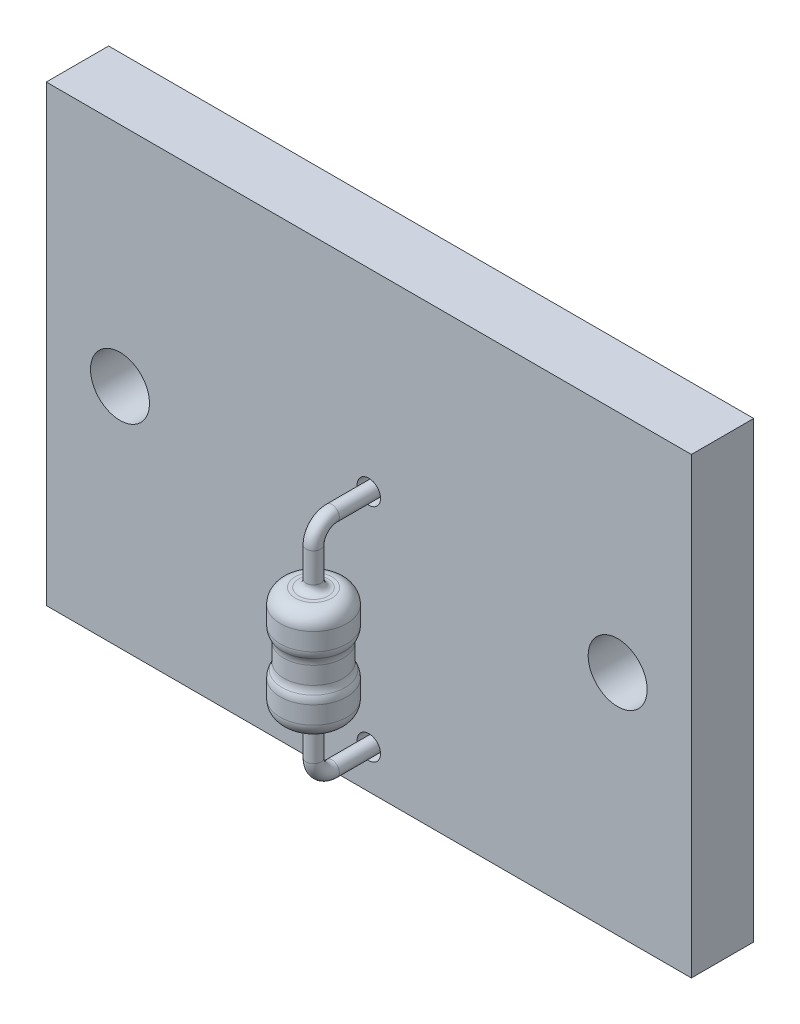
ISO-10303-21;
HEADER;
FILE_DESCRIPTION(('STEP AP214'),'2;1');
FILE_NAME('part.step','',(''),(''),'','','');
FILE_SCHEMA(('AUTOMOTIVE_DESIGN { 1 0 10303 214 1 1 1 1 }'));
ENDSEC;
DATA;
#1=APPLICATION_CONTEXT('core data for automotive mechanical design processes');
#2=APPLICATION_PROTOCOL_DEFINITION('international standard','automotive_design',2000,#1);
#3=PRODUCT_CONTEXT('',#1,'mechanical');
#4=PRODUCT('Part','Part','',(#3));
#5=PRODUCT_RELATED_PRODUCT_CATEGORY('part','',(#4));
#6=PRODUCT_DEFINITION_FORMATION('','',#4);
#7=PRODUCT_DEFINITION_CONTEXT('part definition',#1,'design');
#8=PRODUCT_DEFINITION('design','',#6,#7);
#9=PRODUCT_DEFINITION_SHAPE('','',#8);
#10=(LENGTH_UNIT() NAMED_UNIT(*) SI_UNIT(.MILLI.,.METRE.));
#11=(NAMED_UNIT(*) PLANE_ANGLE_UNIT() SI_UNIT($,.RADIAN.));
#12=(NAMED_UNIT(*) SI_UNIT($,.STERADIAN.) SOLID_ANGLE_UNIT());
#13=UNCERTAINTY_MEASURE_WITH_UNIT(LENGTH_MEASURE(1.E-05),#10,'distance_accuracy_value','');
#14=(GEOMETRIC_REPRESENTATION_CONTEXT(3) GLOBAL_UNCERTAINTY_ASSIGNED_CONTEXT((#13)) GLOBAL_UNIT_ASSIGNED_CONTEXT((#10,
#11,#12)) REPRESENTATION_CONTEXT('',''));
#15=CARTESIAN_POINT('',(0.,0.,0.));
#16=DIRECTION('',(0.,0.,1.));
#17=DIRECTION('',(1.,0.,0.));
#18=AXIS2_PLACEMENT_3D('',#15,#16,#17);
#19=CARTESIAN_POINT('',(38.7500230193259,116.750030386428,-1.50000041126607));
#20=DIRECTION('',(0.,-4.37139536292866E-08,-0.999999999999999));
#21=DIRECTION('',(8.74279066920296E-08,-0.999999999999995,4.37139536292867E-08));
#22=AXIS2_PLACEMENT_3D('',#19,#20,#21);
#23=PLANE('',#22);
#24=CARTESIAN_POINT('',(38.7500230193259,116.750030386428,-1.50000041126607));
#25=DIRECTION('',(0.,-4.37139534327458E-08,-0.999999999999999));
#26=DIRECTION('',(8.74279066920296E-08,-0.999999999999995,4.3713953432746E-08));
#27=AXIS2_PLACEMENT_3D('',#24,#25,#26);
#28=CIRCLE('',#27,0.2);
#29=CARTESIAN_POINT('',(38.7500230368114,116.550030386428,-1.50000040252328));
#30=VERTEX_POINT('',#29);
#31=EDGE_CURVE('P0_E63',#30,#30,#28,.F.);
#32=ORIENTED_EDGE('',*,*,#31,.F.);
#33=EDGE_LOOP('',(#32));
#34=FACE_BOUND('',#33,.T.);
#35=ADVANCED_FACE('P0_F16',(#34),#23,.T.);
#36=CARTESIAN_POINT('',(38.7500230193259,116.750030495713,0.99999958873393));
#37=DIRECTION('',(0.,-4.37139534327458E-08,-0.999999999999999));
#38=DIRECTION('',(8.74279066920296E-08,-0.999999999999995,4.3713953432746E-08));
#39=AXIS2_PLACEMENT_3D('',#36,#37,#38);
#40=CYLINDRICAL_SURFACE('',#39,0.2);
#41=ORIENTED_EDGE('',*,*,#31,.T.);
#42=EDGE_LOOP('',(#41));
#43=FACE_BOUND('',#42,.T.);
#44=CARTESIAN_POINT('',(38.7500230193259,116.750030495713,0.999999588733931));
#45=DIRECTION('',(0.,-4.37139534684743E-08,-0.999999999999999));
#46=DIRECTION('',(8.74279066920296E-08,-0.999999999999995,4.37139534684745E-08));
#47=AXIS2_PLACEMENT_3D('',#44,#45,#46);
#48=CIRCLE('',#47,0.2);
#49=CARTESIAN_POINT('',(38.7500230368114,116.550030495713,0.999999597476721));
#50=VERTEX_POINT('',#49);
#51=EDGE_CURVE('P0_E264',#50,#50,#48,.F.);
#52=ORIENTED_EDGE('',*,*,#51,.F.);
#53=EDGE_LOOP('',(#52));
#54=FACE_BOUND('',#53,.T.);
#55=ADVANCED_FACE('P0_F208',(#43,#54),#40,.T.);
#56=CARTESIAN_POINT('',(38.7500229756119,117.250030495713,0.999999566876954));
#57=DIRECTION('',(0.999999999999996,8.74279066920297E-08,0.));
#58=DIRECTION('',(-8.74279066920296E-08,0.999999999999995,-4.3713953463975E-08));
#59=AXIS2_PLACEMENT_3D('',#56,#57,#58);
#60=TOROIDAL_SURFACE('',#59,0.500000000000003,0.2);
#61=CARTESIAN_POINT('',(38.7500229756119,117.25003051757,1.49999956687695));
#62=DIRECTION('',(-8.74279066920296E-08,0.999999999999995,-4.37139533460098E-08));
#63=DIRECTION('',(-0.999999999999996,-8.74279066920297E-08,0.));
#64=AXIS2_PLACEMENT_3D('',#61,#62,#63);
#65=CIRCLE('',#64,0.2);
#66=CARTESIAN_POINT('',(38.5500229756119,117.250030500084,1.49999956687695));
#67=VERTEX_POINT('',#66);
#68=EDGE_CURVE('P0_E202',#67,#67,#65,.T.);
#69=ORIENTED_EDGE('',*,*,#68,.F.);
#70=EDGE_LOOP('',(#69));
#71=FACE_BOUND('',#70,.T.);
#72=ORIENTED_EDGE('',*,*,#51,.T.);
#73=EDGE_LOOP('',(#72));
#74=FACE_BOUND('',#73,.T.);
#75=ADVANCED_FACE('P0_F206',(#71,#74),#60,.T.);
#76=CARTESIAN_POINT('',(38.7500229756119,117.25003051757,1.49999956687695));
#77=DIRECTION('',(-8.74279066920296E-08,0.999999999999995,-4.37139533460098E-08));
#78=DIRECTION('',(-0.999999999999996,-8.74279066920297E-08,0.));
#79=AXIS2_PLACEMENT_3D('',#76,#77,#78);
#80=CYLINDRICAL_SURFACE('',#79,0.2);
#81=CARTESIAN_POINT('',(38.7500229056696,118.05003051757,1.49999953190579));
#82=DIRECTION('',(-8.74279066920296E-08,0.999999999999995,-4.37139533460098E-08));
#83=DIRECTION('',(-0.999999999999996,-8.74279066920297E-08,0.));
#84=AXIS2_PLACEMENT_3D('',#81,#82,#83);
#85=CIRCLE('',#84,0.2);
#86=CARTESIAN_POINT('',(38.5500229056696,118.050030500084,1.49999953190579));
#87=VERTEX_POINT('',#86);
#88=EDGE_CURVE('P0_E199',#87,#87,#85,.F.);
#89=ORIENTED_EDGE('',*,*,#88,.T.);
#90=EDGE_LOOP('',(#89));
#91=FACE_BOUND('',#90,.T.);
#92=ORIENTED_EDGE('',*,*,#68,.T.);
#93=EDGE_LOOP('',(#92));
#94=FACE_BOUND('',#93,.T.);
#95=ADVANCED_FACE('P0_F181',(#91,#94),#80,.T.);
#96=CARTESIAN_POINT('',(38.7500229056696,118.05003051757,1.49999953190579));
#97=DIRECTION('',(-8.74279066920296E-08,0.999999999999995,-4.37139533460098E-08));
#98=DIRECTION('',(-0.999999999999996,-8.74279066920297E-08,0.));
#99=AXIS2_PLACEMENT_3D('',#96,#97,#98);
#100=TOROIDAL_SURFACE('',#99,0.399999999999999,0.2);
#101=CARTESIAN_POINT('',(38.750022888184,118.25003051757,1.499999523163));
#102=DIRECTION('',(8.74279066920296E-08,-0.999999999999995,4.37139533460098E-08));
#103=DIRECTION('',(0.999999999999996,8.74279121321211E-08,0.));
#104=AXIS2_PLACEMENT_3D('',#101,#102,#103);
#105=CIRCLE('',#104,0.399999999999999);
#106=CARTESIAN_POINT('',(39.150022888184,118.250030552541,1.499999523163));
#107=VERTEX_POINT('',#106);
#108=CARTESIAN_POINT('',(38.350022888184,118.250030482599,1.499999523163));
#109=VERTEX_POINT('',#108);
#110=EDGE_CURVE('P0_E187',#107,#109,#105,.T.);
#111=ORIENTED_EDGE('',*,*,#110,.T.);
#112=CARTESIAN_POINT('',(38.750022888184,118.25003051757,1.499999523163));
#113=DIRECTION('',(8.74279066920296E-08,-0.999999999999995,4.37139533460098E-08));
#114=DIRECTION('',(-0.999999999999996,-8.74279121321211E-08,0.));
#115=AXIS2_PLACEMENT_3D('',#112,#113,#114);
#116=CIRCLE('',#115,0.399999999999999);
#117=EDGE_CURVE('P0_E168',#109,#107,#116,.T.);
#118=ORIENTED_EDGE('',*,*,#117,.T.);
#119=EDGE_LOOP('',(#111,#118));
#120=FACE_BOUND('',#119,.T.);
#121=ORIENTED_EDGE('',*,*,#88,.F.);
#122=EDGE_LOOP('',(#121));
#123=FACE_BOUND('',#122,.T.);
#124=ADVANCED_FACE('P0_F172',(#120,#123),#100,.F.);
#125=CARTESIAN_POINT('',(38.750022888184,118.25003051757,1.499999523163));
#126=DIRECTION('',(-8.74279066920296E-08,0.999999999999995,-4.37139533460098E-08));
#127=DIRECTION('',(-0.999999999999996,-8.74279066920297E-08,0.));
#128=AXIS2_PLACEMENT_3D('',#125,#126,#127);
#129=PLANE('',#128);
#130=CARTESIAN_POINT('',(38.750022888184,118.25003051757,1.499999523163));
#131=DIRECTION('',(-8.74279066920296E-08,0.999999999999995,-4.37139533460098E-08));
#132=DIRECTION('',(-0.999999999999996,-8.74278982543339E-08,0.));
#133=AXIS2_PLACEMENT_3D('',#130,#131,#132);
#134=CIRCLE('',#133,0.499999999999995);
#135=CARTESIAN_POINT('',(38.250022888184,118.250030473856,1.499999523163));
#136=VERTEX_POINT('',#135);
#137=CARTESIAN_POINT('',(39.250022888184,118.250030561284,1.499999523163));
#138=VERTEX_POINT('',#137);
#139=EDGE_CURVE('P0_E516',#136,#138,#134,.T.);
#140=ORIENTED_EDGE('',*,*,#139,.F.);
#141=CARTESIAN_POINT('',(38.750022888184,118.25003051757,1.499999523163));
#142=DIRECTION('',(-8.74279066920296E-08,0.999999999999995,-4.37139533460098E-08));
#143=DIRECTION('',(0.999999999999996,8.74278982543339E-08,0.));
#144=AXIS2_PLACEMENT_3D('',#141,#142,#143);
#145=CIRCLE('',#144,0.499999999999995);
#146=EDGE_CURVE('P0_E198',#138,#136,#145,.T.);
#147=ORIENTED_EDGE('',*,*,#146,.F.);
#148=EDGE_LOOP('',(#140,#147));
#149=FACE_BOUND('',#148,.T.);
#150=ORIENTED_EDGE('',*,*,#117,.F.);
#151=ORIENTED_EDGE('',*,*,#110,.F.);
#152=EDGE_LOOP('',(#150,#151));
#153=FACE_BOUND('',#152,.T.);
#154=ADVANCED_FACE('P0_F145',(#149,#153),#129,.F.);
#155=CARTESIAN_POINT('',(38.7500228532128,118.65003051757,1.49999950567742));
#156=DIRECTION('',(-8.74279066920296E-08,0.999999999999995,-4.37139533460098E-08));
#157=DIRECTION('',(-0.999999999999996,-8.74279066920297E-08,0.));
#158=AXIS2_PLACEMENT_3D('',#155,#156,#157);
#159=TOROIDAL_SURFACE('',#158,0.499999999999995,0.4);
#160=CARTESIAN_POINT('',(38.7500228532128,118.65003051757,1.49999950567742));
#161=DIRECTION('',(8.74279066920296E-08,-0.999999999999995,4.37139533460098E-08));
#162=DIRECTION('',(0.999999999999996,8.74279066920297E-08,0.));
#163=AXIS2_PLACEMENT_3D('',#160,#161,#162);
#164=CIRCLE('',#163,0.9);
#165=CARTESIAN_POINT('',(39.6500228532128,118.650030596255,1.49999950567742));
#166=VERTEX_POINT('',#165);
#167=EDGE_CURVE('P0_E136',#166,#166,#164,.F.);
#168=ORIENTED_EDGE('',*,*,#167,.F.);
#169=EDGE_LOOP('',(#168));
#170=FACE_BOUND('',#169,.T.);
#171=ORIENTED_EDGE('',*,*,#146,.T.);
#172=ORIENTED_EDGE('',*,*,#139,.T.);
#173=EDGE_LOOP('',(#171,#172));
#174=FACE_BOUND('',#173,.T.);
#175=ADVANCED_FACE('P0_F141',(#170,#174),#159,.T.);
#176=CARTESIAN_POINT('',(38.7500228007561,119.25003051757,1.49999947944905));
#177=DIRECTION('',(8.74279066920296E-08,-0.999999999999995,4.37139533460098E-08));
#178=DIRECTION('',(0.999999999999996,8.74279066920297E-08,0.));
#179=AXIS2_PLACEMENT_3D('',#176,#177,#178);
#180=CYLINDRICAL_SURFACE('',#179,0.9);
#181=CARTESIAN_POINT('',(38.7500228114855,119.127307314056,1.49999948481376));
#182=DIRECTION('',(8.74279066920296E-08,-0.999999999999995,4.37139533460098E-08));
#183=DIRECTION('',(0.999999999999996,8.74279066920297E-08,0.));
#184=AXIS2_PLACEMENT_3D('',#181,#182,#183);
#185=CIRCLE('',#184,0.9);
#186=CARTESIAN_POINT('',(39.6500228114855,119.127307392741,1.49999948481376));
#187=VERTEX_POINT('',#186);
#188=EDGE_CURVE('P0_E133',#187,#187,#185,.F.);
#189=ORIENTED_EDGE('',*,*,#188,.F.);
#190=EDGE_LOOP('',(#189));
#191=FACE_BOUND('',#190,.T.);
#192=ORIENTED_EDGE('',*,*,#167,.T.);
#193=EDGE_LOOP('',(#192));
#194=FACE_BOUND('',#193,.T.);
#195=ADVANCED_FACE('P0_F128',(#191,#194),#180,.T.);
#196=CARTESIAN_POINT('',(38.7500228114855,119.127307314056,1.49999948481376));
#197=DIRECTION('',(8.74279066920296E-08,-0.999999999999995,4.37139533460098E-08));
#198=DIRECTION('',(0.999999999999996,8.74279066920297E-08,0.));
#199=AXIS2_PLACEMENT_3D('',#196,#197,#198);
#200=TOROIDAL_SURFACE('',#199,0.500000000000002,0.4);
#201=ORIENTED_EDGE('',*,*,#188,.T.);
#202=EDGE_LOOP('',(#201));
#203=FACE_BOUND('',#202,.T.);
#204=CARTESIAN_POINT('',(38.7500227945552,119.320956481366,1.49999947634859));
#205=DIRECTION('',(8.74279066920296E-08,-0.999999999999995,4.37139533460098E-08));
#206=DIRECTION('',(0.999999999999996,8.74279066920297E-08,0.));
#207=AXIS2_PLACEMENT_3D('',#204,#205,#206);
#208=CIRCLE('',#207,0.849999999999843);
#209=CARTESIAN_POINT('',(39.600022794555,119.32095655568,1.49999947634859));
#210=VERTEX_POINT('',#209);
#211=EDGE_CURVE('P0_E115',#210,#210,#208,.T.);
#212=ORIENTED_EDGE('',*,*,#211,.T.);
#213=EDGE_LOOP('',(#212));
#214=FACE_BOUND('',#213,.T.);
#215=ADVANCED_FACE('P0_F124',(#203,#214),#200,.T.);
#216=CARTESIAN_POINT('',(38.7500227776248,119.514605648676,1.49999946788342));
#217=DIRECTION('',(8.74279066920296E-08,-0.999999999999995,4.37139533460098E-08));
#218=DIRECTION('',(0.999999999999996,8.74279066920297E-08,0.));
#219=AXIS2_PLACEMENT_3D('',#216,#217,#218);
#220=TOROIDAL_SURFACE('',#219,1.2,0.4);
#221=ORIENTED_EDGE('',*,*,#211,.F.);
#222=EDGE_LOOP('',(#221));
#223=FACE_BOUND('',#222,.T.);
#224=CARTESIAN_POINT('',(38.7500227776248,119.514605648676,1.49999946788342));
#225=DIRECTION('',(8.74279066920296E-08,-0.999999999999995,4.37139533460098E-08));
#226=DIRECTION('',(0.999999999999996,8.74279066920297E-08,0.));
#227=AXIS2_PLACEMENT_3D('',#224,#225,#226);
#228=CIRCLE('',#227,0.8);
#229=CARTESIAN_POINT('',(39.5500227776248,119.514605718618,1.49999946788342));
#230=VERTEX_POINT('',#229);
#231=EDGE_CURVE('P0_E112',#230,#230,#228,.F.);
#232=ORIENTED_EDGE('',*,*,#231,.F.);
#233=EDGE_LOOP('',(#232));
#234=FACE_BOUND('',#233,.T.);
#235=ADVANCED_FACE('P0_F120',(#223,#234),#220,.F.);
#236=CARTESIAN_POINT('',(38.7500227133282,120.25003051757,1.49999943573509));
#237=DIRECTION('',(8.74279066920296E-08,-0.999999999999995,4.37139533460098E-08));
#238=DIRECTION('',(0.999999999999996,8.74279066920297E-08,0.));
#239=AXIS2_PLACEMENT_3D('',#236,#237,#238);
#240=CYLINDRICAL_SURFACE('',#239,0.8);
#241=ORIENTED_EDGE('',*,*,#231,.T.);
#242=EDGE_LOOP('',(#241));
#243=FACE_BOUND('',#242,.T.);
#244=CARTESIAN_POINT('',(38.7500227364594,119.985455386464,1.49999944730072));
#245=DIRECTION('',(-8.74279066920296E-08,0.999999999999995,-4.37139533460098E-08));
#246=DIRECTION('',(-0.999999999999996,-8.74279066920297E-08,0.));
#247=AXIS2_PLACEMENT_3D('',#244,#245,#246);
#248=CIRCLE('',#247,0.8);
#249=CARTESIAN_POINT('',(37.9500227364594,119.985455316522,1.49999944730072));
#250=VERTEX_POINT('',#249);
#251=EDGE_CURVE('P0_E107',#250,#250,#248,.F.);
#252=ORIENTED_EDGE('',*,*,#251,.T.);
#253=EDGE_LOOP('',(#252));
#254=FACE_BOUND('',#253,.T.);
#255=ADVANCED_FACE('P0_F123',(#243,#254),#240,.T.);
#256=CARTESIAN_POINT('',(38.7500227364594,119.985455386464,1.49999944730072));
#257=DIRECTION('',(-8.74279066920296E-08,0.999999999999995,-4.37139533460098E-08));
#258=DIRECTION('',(-0.999999999999996,-8.74279066920297E-08,0.));
#259=AXIS2_PLACEMENT_3D('',#256,#257,#258);
#260=TOROIDAL_SURFACE('',#259,1.2,0.4);
#261=CARTESIAN_POINT('',(38.7500227195291,120.179104553774,1.49999943883555));
#262=DIRECTION('',(8.74279066920296E-08,-0.999999999999995,4.37139533460098E-08));
#263=DIRECTION('',(0.999999999999996,8.74279066920297E-08,0.));
#264=AXIS2_PLACEMENT_3D('',#261,#262,#263);
#265=CIRCLE('',#264,0.850000000000157);
#266=CARTESIAN_POINT('',(39.6000227195293,120.179104628088,1.49999943883555));
#267=VERTEX_POINT('',#266);
#268=EDGE_CURVE('P0_E105',#267,#267,#265,.F.);
#269=ORIENTED_EDGE('',*,*,#268,.F.);
#270=EDGE_LOOP('',(#269));
#271=FACE_BOUND('',#270,.T.);
#272=ORIENTED_EDGE('',*,*,#251,.F.);
#273=EDGE_LOOP('',(#272));
#274=FACE_BOUND('',#273,.T.);
#275=ADVANCED_FACE('P0_F99',(#271,#274),#260,.F.);
#276=CARTESIAN_POINT('',(38.7500227025988,120.372753721084,1.49999943037038));
#277=DIRECTION('',(8.74279066920296E-08,-0.999999999999995,4.37139533460098E-08));
#278=DIRECTION('',(0.999999999999996,8.74279066920297E-08,0.));
#279=AXIS2_PLACEMENT_3D('',#276,#277,#278);
#280=TOROIDAL_SURFACE('',#279,0.500000000000002,0.4);
#281=ORIENTED_EDGE('',*,*,#268,.T.);
#282=EDGE_LOOP('',(#281));
#283=FACE_BOUND('',#282,.T.);
#284=CARTESIAN_POINT('',(38.7500227025988,120.372753721084,1.49999943037038));
#285=DIRECTION('',(8.74279066920296E-08,-0.999999999999995,4.37139533460098E-08));
#286=DIRECTION('',(0.999999999999996,8.74279066920297E-08,0.));
#287=AXIS2_PLACEMENT_3D('',#284,#285,#286);
#288=CIRCLE('',#287,0.9);
#289=CARTESIAN_POINT('',(39.6500227025987,120.372753799769,1.49999943037038));
#290=VERTEX_POINT('',#289);
#291=EDGE_CURVE('P0_E78',#290,#290,#288,.F.);
#292=ORIENTED_EDGE('',*,*,#291,.F.);
#293=EDGE_LOOP('',(#292));
#294=FACE_BOUND('',#293,.T.);
#295=ADVANCED_FACE('P0_F95',(#283,#294),#280,.T.);
#296=CARTESIAN_POINT('',(38.7500226259003,121.25003051757,1.49999939202114));
#297=DIRECTION('',(8.74279066920296E-08,-0.999999999999995,4.37139533460098E-08));
#298=DIRECTION('',(0.999999999999996,8.74279066920297E-08,0.));
#299=AXIS2_PLACEMENT_3D('',#296,#297,#298);
#300=CYLINDRICAL_SURFACE('',#299,0.9);
#301=ORIENTED_EDGE('',*,*,#291,.T.);
#302=EDGE_LOOP('',(#301));
#303=FACE_BOUND('',#302,.T.);
#304=CARTESIAN_POINT('',(38.7500226608714,120.85003051757,1.49999940950672));
#305=DIRECTION('',(-8.74279066920296E-08,0.999999999999995,-4.37139533460098E-08));
#306=DIRECTION('',(-0.999999999999996,-8.74279066920297E-08,0.));
#307=AXIS2_PLACEMENT_3D('',#304,#305,#306);
#308=CIRCLE('',#307,0.9);
#309=CARTESIAN_POINT('',(37.8500226608714,120.850030438885,1.49999940950672));
#310=VERTEX_POINT('',#309);
#311=EDGE_CURVE('P0_E70',#310,#310,#308,.T.);
#312=ORIENTED_EDGE('',*,*,#311,.F.);
#313=EDGE_LOOP('',(#312));
#314=FACE_BOUND('',#313,.T.);
#315=ADVANCED_FACE('P0_F89',(#303,#314),#300,.T.);
#316=CARTESIAN_POINT('',(38.7500226608714,120.85003051757,1.49999940950672));
#317=DIRECTION('',(-8.74279066920296E-08,0.999999999999995,-4.37139533460098E-08));
#318=DIRECTION('',(-0.999999999999996,-8.74279066920297E-08,0.));
#319=AXIS2_PLACEMENT_3D('',#316,#317,#318);
#320=TOROIDAL_SURFACE('',#319,0.500000000000002,0.4);
#321=CARTESIAN_POINT('',(38.7500226259003,121.25003051757,1.49999939202114));
#322=DIRECTION('',(8.74279066920296E-08,-0.999999999999995,4.37139533460098E-08));
#323=DIRECTION('',(-0.999999999999996,-8.74278982543326E-08,0.));
#324=AXIS2_PLACEMENT_3D('',#321,#322,#323);
#325=CIRCLE('',#324,0.500000000000002);
#326=CARTESIAN_POINT('',(39.2500226259003,121.250030561284,1.49999939202114));
#327=VERTEX_POINT('',#326);
#328=CARTESIAN_POINT('',(38.2500226259003,121.250030473856,1.49999939202114));
#329=VERTEX_POINT('',#328);
#330=EDGE_CURVE('P0_E56',#327,#329,#325,.F.);
#331=ORIENTED_EDGE('',*,*,#330,.F.);
#332=CARTESIAN_POINT('',(38.7500226259003,121.25003051757,1.49999939202114));
#333=DIRECTION('',(8.74279066920296E-08,-0.999999999999995,4.37139533460098E-08));
#334=DIRECTION('',(0.999999999999996,8.74278982543326E-08,0.));
#335=AXIS2_PLACEMENT_3D('',#332,#333,#334);
#336=CIRCLE('',#335,0.500000000000002);
#337=EDGE_CURVE('P0_E59',#327,#329,#336,.T.);
#338=ORIENTED_EDGE('',*,*,#337,.T.);
#339=EDGE_LOOP('',(#331,#338));
#340=FACE_BOUND('',#339,.T.);
#341=ORIENTED_EDGE('',*,*,#311,.T.);
#342=EDGE_LOOP('',(#341));
#343=FACE_BOUND('',#342,.T.);
#344=ADVANCED_FACE('P0_F67',(#340,#343),#320,.T.);
#345=CARTESIAN_POINT('',(38.7500226259003,121.25003051757,1.49999939202114));
#346=DIRECTION('',(-8.74279066920296E-08,0.999999999999995,-4.37139533460098E-08));
#347=DIRECTION('',(-0.999999999999996,-8.74279066920297E-08,0.));
#348=AXIS2_PLACEMENT_3D('',#345,#346,#347);
#349=PLANE('',#348);
#350=ORIENTED_EDGE('',*,*,#337,.F.);
#351=ORIENTED_EDGE('',*,*,#330,.T.);
#352=EDGE_LOOP('',(#350,#351));
#353=FACE_BOUND('',#352,.T.);
#354=CARTESIAN_POINT('',(38.7500226259003,121.25003051757,1.49999939202114));
#355=DIRECTION('',(-8.74279066920296E-08,0.999999999999995,-4.37139533460098E-08));
#356=DIRECTION('',(0.999999999999996,8.74279121321195E-08,0.));
#357=AXIS2_PLACEMENT_3D('',#354,#355,#356);
#358=CIRCLE('',#357,0.400000000000006);
#359=CARTESIAN_POINT('',(38.3500226259003,121.250030482599,1.49999939202114));
#360=VERTEX_POINT('',#359);
#361=CARTESIAN_POINT('',(39.1500226259003,121.250030552541,1.49999939202114));
#362=VERTEX_POINT('',#361);
#363=EDGE_CURVE('P0_E35',#360,#362,#358,.F.);
#364=ORIENTED_EDGE('',*,*,#363,.T.);
#365=CARTESIAN_POINT('',(38.7500226259003,121.25003051757,1.49999939202114));
#366=DIRECTION('',(-8.74279066920296E-08,0.999999999999995,-4.37139533460098E-08));
#367=DIRECTION('',(-0.999999999999996,-8.74279121321195E-08,0.));
#368=AXIS2_PLACEMENT_3D('',#365,#366,#367);
#369=CIRCLE('',#368,0.400000000000006);
#370=EDGE_CURVE('P0_E69',#362,#360,#369,.F.);
#371=ORIENTED_EDGE('',*,*,#370,.T.);
#372=EDGE_LOOP('',(#364,#371));
#373=FACE_BOUND('',#372,.T.);
#374=ADVANCED_FACE('P0_F61',(#353,#373),#349,.T.);
#375=CARTESIAN_POINT('',(38.7500226084147,121.45003051757,1.49999938327835));
#376=DIRECTION('',(-8.74279066920296E-08,0.999999999999995,-4.37139533460098E-08));
#377=DIRECTION('',(-0.999999999999996,-8.74279066920297E-08,0.));
#378=AXIS2_PLACEMENT_3D('',#375,#376,#377);
#379=TOROIDAL_SURFACE('',#378,0.400000000000006,0.2);
#380=ORIENTED_EDGE('',*,*,#363,.F.);
#381=ORIENTED_EDGE('',*,*,#370,.F.);
#382=EDGE_LOOP('',(#380,#381));
#383=FACE_BOUND('',#382,.T.);
#384=CARTESIAN_POINT('',(38.7500226084147,121.45003051757,1.49999938327835));
#385=DIRECTION('',(8.74279066920296E-08,-0.999999999999995,4.37139534375294E-08));
#386=DIRECTION('',(0.,4.37139534375292E-08,0.999999999999999));
#387=AXIS2_PLACEMENT_3D('',#384,#385,#386);
#388=CIRCLE('',#387,0.2);
#389=CARTESIAN_POINT('',(38.7500226084147,121.450030526313,1.69999938327835));
#390=VERTEX_POINT('',#389);
#391=EDGE_CURVE('P0_E244',#390,#390,#388,.F.);
#392=ORIENTED_EDGE('',*,*,#391,.F.);
#393=EDGE_LOOP('',(#392));
#394=FACE_BOUND('',#393,.T.);
#395=ADVANCED_FACE('P0_F247',(#383,#394),#379,.F.);
#396=CARTESIAN_POINT('',(38.7500225384724,122.25003051757,1.49999934830719));
#397=DIRECTION('',(8.74279066920296E-08,-0.999999999999995,4.37139534375294E-08));
#398=DIRECTION('',(0.,4.37139534375292E-08,0.999999999999999));
#399=AXIS2_PLACEMENT_3D('',#396,#397,#398);
#400=CYLINDRICAL_SURFACE('',#399,0.2);
#401=CARTESIAN_POINT('',(38.7500225384724,122.25003051757,1.49999934830719));
#402=DIRECTION('',(-8.74279066920296E-08,0.999999999999995,-4.37139532847775E-08));
#403=DIRECTION('',(0.,4.37139532847773E-08,0.999999999999999));
#404=AXIS2_PLACEMENT_3D('',#401,#402,#403);
#405=CIRCLE('',#404,0.2);
#406=CARTESIAN_POINT('',(38.7500225384724,122.250030526313,1.69999934830719));
#407=VERTEX_POINT('',#406);
#408=EDGE_CURVE('P0_E241',#407,#407,#405,.T.);
#409=ORIENTED_EDGE('',*,*,#408,.F.);
#410=EDGE_LOOP('',(#409));
#411=FACE_BOUND('',#410,.T.);
#412=ORIENTED_EDGE('',*,*,#391,.T.);
#413=EDGE_LOOP('',(#412));
#414=FACE_BOUND('',#413,.T.);
#415=ADVANCED_FACE('P0_F236',(#411,#414),#400,.T.);
#416=CARTESIAN_POINT('',(38.7500225384724,122.250030495713,0.999999348307187));
#417=DIRECTION('',(-0.999999999999996,-8.74279066920297E-08,0.));
#418=DIRECTION('',(8.74279066920296E-08,-0.999999999999995,4.3713953463975E-08));
#419=AXIS2_PLACEMENT_3D('',#416,#417,#418);
#420=TOROIDAL_SURFACE('',#419,0.500000000000003,0.2);
#421=ORIENTED_EDGE('',*,*,#408,.T.);
#422=EDGE_LOOP('',(#421));
#423=FACE_BOUND('',#422,.T.);
#424=CARTESIAN_POINT('',(38.7500224947584,122.750030495713,0.99999932645021));
#425=DIRECTION('',(0.,-4.37139533460096E-08,-0.999999999999999));
#426=DIRECTION('',(8.74279066920296E-08,-0.999999999999995,4.37139533460098E-08));
#427=AXIS2_PLACEMENT_3D('',#424,#425,#426);
#428=CIRCLE('',#427,0.2);
#429=CARTESIAN_POINT('',(38.750022512244,122.550030495713,0.999999335193001));
#430=VERTEX_POINT('',#429);
#431=EDGE_CURVE('P0_E27',#430,#430,#428,.T.);
#432=ORIENTED_EDGE('',*,*,#431,.F.);
#433=EDGE_LOOP('',(#432));
#434=FACE_BOUND('',#433,.T.);
#435=ADVANCED_FACE('P0_F227',(#423,#434),#420,.T.);
#436=CARTESIAN_POINT('',(38.7500224947584,122.750030386428,-1.50000067354979));
#437=DIRECTION('',(0.,-4.37139532847773E-08,-0.999999999999999));
#438=DIRECTION('',(8.74279066920296E-08,-0.999999999999995,4.37139532847775E-08));
#439=AXIS2_PLACEMENT_3D('',#436,#437,#438);
#440=PLANE('',#439);
#441=CARTESIAN_POINT('',(38.7500224947584,122.750030386428,-1.50000067354979));
#442=DIRECTION('',(0.,-4.37139533460096E-08,-0.999999999999999));
#443=DIRECTION('',(8.74279066920296E-08,-0.999999999999995,4.37139533460098E-08));
#444=AXIS2_PLACEMENT_3D('',#441,#442,#443);
#445=CIRCLE('',#444,0.2);
#446=CARTESIAN_POINT('',(38.750022512244,122.550030386428,-1.500000664807));
#447=VERTEX_POINT('',#446);
#448=EDGE_CURVE('P0_E10',#447,#447,#445,.F.);
#449=ORIENTED_EDGE('',*,*,#448,.F.);
#450=EDGE_LOOP('',(#449));
#451=FACE_BOUND('',#450,.T.);
#452=ADVANCED_FACE('P0_F221',(#451),#440,.T.);
#453=CARTESIAN_POINT('',(38.7500224947584,122.750030495713,0.99999932645021));
#454=DIRECTION('',(0.,-4.37139533460096E-08,-0.999999999999999));
#455=DIRECTION('',(8.74279066920296E-08,-0.999999999999995,4.37139533460098E-08));
#456=AXIS2_PLACEMENT_3D('',#453,#454,#455);
#457=CYLINDRICAL_SURFACE('',#456,0.2);
#458=ORIENTED_EDGE('',*,*,#431,.T.);
#459=EDGE_LOOP('',(#458));
#460=FACE_BOUND('',#459,.T.);
#461=ORIENTED_EDGE('',*,*,#448,.T.);
#462=EDGE_LOOP('',(#461));
#463=FACE_BOUND('',#462,.T.);
#464=ADVANCED_FACE('P0_F219',(#460,#463),#457,.T.);
#465=CLOSED_SHELL('',(#35,#55,#75,#95,#124,#154,#175,#195,#215,#235,#255,#275,#295,#315,#344,
#374,#395,#415,#435,#452,#464));
#466=MANIFOLD_SOLID_BREP('P0_B1',#465);
#467=CARTESIAN_POINT('',(30.00000096,128.00000054,0.));
#468=DIRECTION('',(0.,0.,1.));
#469=DIRECTION('',(1.,0.,0.));
#470=AXIS2_PLACEMENT_3D('',#467,#468,#469);
#471=PLANE('',#470);
#472=CARTESIAN_POINT('',(38.75000124,122.74999834,0.));
#473=DIRECTION('',(0.,0.,-1.));
#474=DIRECTION('',(-1.,0.,0.));
#475=AXIS2_PLACEMENT_3D('',#472,#473,#474);
#476=CIRCLE('',#475,0.3175);
#477=CARTESIAN_POINT('',(38.43250124,122.74999834,0.));
#478=VERTEX_POINT('',#477);
#479=EDGE_CURVE('P1_E92',#478,#478,#476,.T.);
#480=ORIENTED_EDGE('',*,*,#479,.T.);
#481=EDGE_LOOP('',(#480));
#482=FACE_BOUND('',#481,.T.);
#483=CARTESIAN_POINT('',(45.50000044,121.87499882,0.));
#484=DIRECTION('',(0.,0.,-1.));
#485=DIRECTION('',(-1.,0.,0.));
#486=AXIS2_PLACEMENT_3D('',#483,#484,#485);
#487=CIRCLE('',#486,0.7999984);
#488=CARTESIAN_POINT('',(44.70000204,121.87499882,0.));
#489=VERTEX_POINT('',#488);
#490=EDGE_CURVE('P1_E95',#489,#489,#487,.T.);
#491=ORIENTED_EDGE('',*,*,#490,.T.);
#492=EDGE_LOOP('',(#491));
#493=FACE_BOUND('',#492,.T.);
#494=CARTESIAN_POINT('',(31.9999995,121.85000014,0.));
#495=DIRECTION('',(0.,0.,-1.));
#496=DIRECTION('',(-1.,0.,0.));
#497=AXIS2_PLACEMENT_3D('',#494,#495,#496);
#498=CIRCLE('',#497,0.7999984);
#499=CARTESIAN_POINT('',(31.2000011,121.85000014,0.));
#500=VERTEX_POINT('',#499);
#501=EDGE_CURVE('P1_E97',#500,#500,#498,.T.);
#502=ORIENTED_EDGE('',*,*,#501,.T.);
#503=EDGE_LOOP('',(#502));
#504=FACE_BOUND('',#503,.T.);
#505=CARTESIAN_POINT('',(38.75000124,116.75000018,0.));
#506=DIRECTION('',(0.,0.,-1.));
#507=DIRECTION('',(-1.,0.,0.));
#508=AXIS2_PLACEMENT_3D('',#505,#506,#507);
#509=CIRCLE('',#508,0.3175);
#510=CARTESIAN_POINT('',(38.43250124,116.75000018,0.));
#511=VERTEX_POINT('',#510);
#512=EDGE_CURVE('P1_E20',#511,#511,#509,.T.);
#513=ORIENTED_EDGE('',*,*,#512,.T.);
#514=EDGE_LOOP('',(#513));
#515=FACE_BOUND('',#514,.T.);
#516=DIRECTION('',(0.,1.,0.));
#517=VECTOR('',#516,1.);
#518=CARTESIAN_POINT('',(47.49999898,128.00000054,0.));
#519=LINE('',#518,#517);
#520=CARTESIAN_POINT('',(47.49999898,128.00000054,0.));
#521=VERTEX_POINT('',#520);
#522=CARTESIAN_POINT('',(47.49999898,115.69999974,0.));
#523=VERTEX_POINT('',#522);
#524=EDGE_CURVE('P1_E54',#521,#523,#519,.F.);
#525=ORIENTED_EDGE('',*,*,#524,.F.);
#526=DIRECTION('',(1.,0.,0.));
#527=VECTOR('',#526,1.);
#528=CARTESIAN_POINT('',(30.00000096,128.00000054,0.));
#529=LINE('',#528,#527);
#530=CARTESIAN_POINT('',(30.00000096,128.00000054,0.));
#531=VERTEX_POINT('',#530);
#532=EDGE_CURVE('P1_E71',#531,#521,#529,.T.);
#533=ORIENTED_EDGE('',*,*,#532,.F.);
#534=DIRECTION('',(0.,1.,0.));
#535=VECTOR('',#534,1.);
#536=CARTESIAN_POINT('',(30.00000096,115.69999974,0.));
#537=LINE('',#536,#535);
#538=CARTESIAN_POINT('',(30.00000096,115.69999974,0.));
#539=VERTEX_POINT('',#538);
#540=EDGE_CURVE('P1_E68',#539,#531,#537,.T.);
#541=ORIENTED_EDGE('',*,*,#540,.F.);
#542=DIRECTION('',(1.,0.,0.));
#543=VECTOR('',#542,1.);
#544=CARTESIAN_POINT('',(47.49999898,115.69999974,0.));
#545=LINE('',#544,#543);
#546=EDGE_CURVE('P1_E59',#523,#539,#545,.F.);
#547=ORIENTED_EDGE('',*,*,#546,.F.);
#548=EDGE_LOOP('',(#525,#533,#541,#547));
#549=FACE_BOUND('',#548,.T.);
#550=ADVANCED_FACE('P1_F17',(#482,#493,#504,#515,#549),#471,.T.);
#551=CARTESIAN_POINT('',(30.00000096,115.69999974,-1.69143934));
#552=DIRECTION('',(-1.,0.,0.));
#553=DIRECTION('',(0.,0.,1.));
#554=AXIS2_PLACEMENT_3D('',#551,#552,#553);
#555=PLANE('',#554);
#556=DIRECTION('',(0.,0.,1.));
#557=VECTOR('',#556,1.);
#558=CARTESIAN_POINT('',(30.00000096,128.00000054,-1.69143934));
#559=LINE('',#558,#557);
#560=CARTESIAN_POINT('',(30.00000096,128.00000054,-1.69143934));
#561=VERTEX_POINT('',#560);
#562=EDGE_CURVE('P1_E105',#561,#531,#559,.T.);
#563=ORIENTED_EDGE('',*,*,#562,.F.);
#564=DIRECTION('',(0.,1.,0.));
#565=VECTOR('',#564,1.);
#566=CARTESIAN_POINT('',(30.00000096,128.00000054,-1.69143934));
#567=LINE('',#566,#565);
#568=CARTESIAN_POINT('',(30.00000096,115.69999974,-1.69143934));
#569=VERTEX_POINT('',#568);
#570=EDGE_CURVE('P1_E78',#561,#569,#567,.F.);
#571=ORIENTED_EDGE('',*,*,#570,.T.);
#572=DIRECTION('',(0.,0.,-1.));
#573=VECTOR('',#572,1.);
#574=CARTESIAN_POINT('',(30.00000096,115.69999974,-1.69143934));
#575=LINE('',#574,#573);
#576=EDGE_CURVE('P1_E64',#539,#569,#575,.T.);
#577=ORIENTED_EDGE('',*,*,#576,.F.);
#578=ORIENTED_EDGE('',*,*,#540,.T.);
#579=EDGE_LOOP('',(#563,#571,#577,#578));
#580=FACE_BOUND('',#579,.T.);
#581=ADVANCED_FACE('P1_F77',(#580),#555,.T.);
#582=CARTESIAN_POINT('',(47.49999898,115.69999974,-1.69143934));
#583=DIRECTION('',(0.,-1.,0.));
#584=DIRECTION('',(0.,0.,-1.));
#585=AXIS2_PLACEMENT_3D('',#582,#583,#584);
#586=PLANE('',#585);
#587=ORIENTED_EDGE('',*,*,#576,.T.);
#588=DIRECTION('',(1.,0.,0.));
#589=VECTOR('',#588,1.);
#590=CARTESIAN_POINT('',(30.00000096,115.69999974,-1.69143934));
#591=LINE('',#590,#589);
#592=CARTESIAN_POINT('',(47.49999898,115.69999974,-1.69143934));
#593=VERTEX_POINT('',#592);
#594=EDGE_CURVE('P1_E116',#569,#593,#591,.T.);
#595=ORIENTED_EDGE('',*,*,#594,.T.);
#596=DIRECTION('',(0.,0.,-1.));
#597=VECTOR('',#596,1.);
#598=CARTESIAN_POINT('',(47.49999898,115.69999974,-1.69143934));
#599=LINE('',#598,#597);
#600=EDGE_CURVE('P1_E66',#523,#593,#599,.T.);
#601=ORIENTED_EDGE('',*,*,#600,.F.);
#602=ORIENTED_EDGE('',*,*,#546,.T.);
#603=EDGE_LOOP('',(#587,#595,#601,#602));
#604=FACE_BOUND('',#603,.T.);
#605=ADVANCED_FACE('P1_F61',(#604),#586,.T.);
#606=CARTESIAN_POINT('',(47.49999898,128.00000054,-1.69143934));
#607=DIRECTION('',(1.,0.,0.));
#608=DIRECTION('',(0.,0.,-1.));
#609=AXIS2_PLACEMENT_3D('',#606,#607,#608);
#610=PLANE('',#609);
#611=ORIENTED_EDGE('',*,*,#600,.T.);
#612=DIRECTION('',(0.,1.,0.));
#613=VECTOR('',#612,1.);
#614=CARTESIAN_POINT('',(47.49999898,128.00000054,-1.69143934));
#615=LINE('',#614,#613);
#616=CARTESIAN_POINT('',(47.49999898,128.00000054,-1.69143934));
#617=VERTEX_POINT('',#616);
#618=EDGE_CURVE('P1_E113',#593,#617,#615,.T.);
#619=ORIENTED_EDGE('',*,*,#618,.T.);
#620=DIRECTION('',(0.,0.,1.));
#621=VECTOR('',#620,1.);
#622=CARTESIAN_POINT('',(47.49999898,128.00000054,-1.69143934));
#623=LINE('',#622,#621);
#624=EDGE_CURVE('P1_E35',#521,#617,#623,.F.);
#625=ORIENTED_EDGE('',*,*,#624,.F.);
#626=ORIENTED_EDGE('',*,*,#524,.T.);
#627=EDGE_LOOP('',(#611,#619,#625,#626));
#628=FACE_BOUND('',#627,.T.);
#629=ADVANCED_FACE('P1_F112',(#628),#610,.T.);
#630=CARTESIAN_POINT('',(30.00000096,128.00000054,-1.69143934));
#631=DIRECTION('',(0.,1.,0.));
#632=DIRECTION('',(0.,0.,1.));
#633=AXIS2_PLACEMENT_3D('',#630,#631,#632);
#634=PLANE('',#633);
#635=ORIENTED_EDGE('',*,*,#624,.T.);
#636=DIRECTION('',(1.,0.,0.));
#637=VECTOR('',#636,1.);
#638=CARTESIAN_POINT('',(30.00000096,128.00000054,-1.69143934));
#639=LINE('',#638,#637);
#640=EDGE_CURVE('P1_E91',#617,#561,#639,.F.);
#641=ORIENTED_EDGE('',*,*,#640,.T.);
#642=ORIENTED_EDGE('',*,*,#562,.T.);
#643=ORIENTED_EDGE('',*,*,#532,.T.);
#644=EDGE_LOOP('',(#635,#641,#642,#643));
#645=FACE_BOUND('',#644,.T.);
#646=ADVANCED_FACE('P1_F119',(#645),#634,.T.);
#647=CARTESIAN_POINT('',(38.75000124,116.75000018,-1.69143934));
#648=DIRECTION('',(0.,0.,-1.));
#649=DIRECTION('',(-1.,0.,0.));
#650=AXIS2_PLACEMENT_3D('',#647,#648,#649);
#651=CYLINDRICAL_SURFACE('',#650,0.3175);
#652=ORIENTED_EDGE('',*,*,#512,.F.);
#653=EDGE_LOOP('',(#652));
#654=FACE_BOUND('',#653,.T.);
#655=CARTESIAN_POINT('',(38.75000124,116.75000018,-1.69143934));
#656=DIRECTION('',(0.,0.,-1.));
#657=DIRECTION('',(-1.,0.,0.));
#658=AXIS2_PLACEMENT_3D('',#655,#656,#657);
#659=CIRCLE('',#658,0.3175);
#660=CARTESIAN_POINT('',(38.43250124,116.75000018,-1.69143934));
#661=VERTEX_POINT('',#660);
#662=EDGE_CURVE('P1_E88',#661,#661,#659,.T.);
#663=ORIENTED_EDGE('',*,*,#662,.T.);
#664=EDGE_LOOP('',(#663));
#665=FACE_BOUND('',#664,.T.);
#666=ADVANCED_FACE('P1_F121',(#654,#665),#651,.F.);
#667=CARTESIAN_POINT('',(31.9999995,121.85000014,-1.69143934));
#668=DIRECTION('',(0.,0.,-1.));
#669=DIRECTION('',(-1.,0.,0.));
#670=AXIS2_PLACEMENT_3D('',#667,#668,#669);
#671=CYLINDRICAL_SURFACE('',#670,0.7999984);
#672=ORIENTED_EDGE('',*,*,#501,.F.);
#673=EDGE_LOOP('',(#672));
#674=FACE_BOUND('',#673,.T.);
#675=CARTESIAN_POINT('',(31.9999995,121.85000014,-1.69143934));
#676=DIRECTION('',(0.,0.,-1.));
#677=DIRECTION('',(-1.,0.,0.));
#678=AXIS2_PLACEMENT_3D('',#675,#676,#677);
#679=CIRCLE('',#678,0.7999984);
#680=CARTESIAN_POINT('',(31.2000011,121.85000014,-1.69143934));
#681=VERTEX_POINT('',#680);
#682=EDGE_CURVE('P1_E85',#681,#681,#679,.T.);
#683=ORIENTED_EDGE('',*,*,#682,.T.);
#684=EDGE_LOOP('',(#683));
#685=FACE_BOUND('',#684,.T.);
#686=ADVANCED_FACE('P1_F128',(#674,#685),#671,.F.);
#687=CARTESIAN_POINT('',(45.50000044,121.87499882,-1.69143934));
#688=DIRECTION('',(0.,0.,-1.));
#689=DIRECTION('',(-1.,0.,0.));
#690=AXIS2_PLACEMENT_3D('',#687,#688,#689);
#691=CYLINDRICAL_SURFACE('',#690,0.7999984);
#692=ORIENTED_EDGE('',*,*,#490,.F.);
#693=EDGE_LOOP('',(#692));
#694=FACE_BOUND('',#693,.T.);
#695=CARTESIAN_POINT('',(45.50000044,121.87499882,-1.69143934));
#696=DIRECTION('',(0.,0.,-1.));
#697=DIRECTION('',(-1.,0.,0.));
#698=AXIS2_PLACEMENT_3D('',#695,#696,#697);
#699=CIRCLE('',#698,0.7999984);
#700=CARTESIAN_POINT('',(44.70000204,121.87499882,-1.69143934));
#701=VERTEX_POINT('',#700);
#702=EDGE_CURVE('P1_E26',#701,#701,#699,.T.);
#703=ORIENTED_EDGE('',*,*,#702,.T.);
#704=EDGE_LOOP('',(#703));
#705=FACE_BOUND('',#704,.T.);
#706=ADVANCED_FACE('P1_F139',(#694,#705),#691,.F.);
#707=CARTESIAN_POINT('',(38.75000124,122.74999834,-1.69143934));
#708=DIRECTION('',(0.,0.,-1.));
#709=DIRECTION('',(-1.,0.,0.));
#710=AXIS2_PLACEMENT_3D('',#707,#708,#709);
#711=CYLINDRICAL_SURFACE('',#710,0.3175);
#712=ORIENTED_EDGE('',*,*,#479,.F.);
#713=EDGE_LOOP('',(#712));
#714=FACE_BOUND('',#713,.T.);
#715=CARTESIAN_POINT('',(38.75000124,122.74999834,-1.69143934));
#716=DIRECTION('',(0.,0.,-1.));
#717=DIRECTION('',(-1.,0.,0.));
#718=AXIS2_PLACEMENT_3D('',#715,#716,#717);
#719=CIRCLE('',#718,0.3175);
#720=CARTESIAN_POINT('',(38.43250124,122.74999834,-1.69143934));
#721=VERTEX_POINT('',#720);
#722=EDGE_CURVE('P1_E11',#721,#721,#719,.T.);
#723=ORIENTED_EDGE('',*,*,#722,.T.);
#724=EDGE_LOOP('',(#723));
#725=FACE_BOUND('',#724,.T.);
#726=ADVANCED_FACE('P1_F133',(#714,#725),#711,.F.);
#727=CARTESIAN_POINT('',(30.00000096,128.00000054,-1.69143934));
#728=DIRECTION('',(0.,0.,1.));
#729=DIRECTION('',(1.,0.,0.));
#730=AXIS2_PLACEMENT_3D('',#727,#728,#729);
#731=PLANE('',#730);
#732=ORIENTED_EDGE('',*,*,#722,.F.);
#733=EDGE_LOOP('',(#732));
#734=FACE_BOUND('',#733,.T.);
#735=ORIENTED_EDGE('',*,*,#702,.F.);
#736=EDGE_LOOP('',(#735));
#737=FACE_BOUND('',#736,.T.);
#738=ORIENTED_EDGE('',*,*,#682,.F.);
#739=EDGE_LOOP('',(#738));
#740=FACE_BOUND('',#739,.T.);
#741=ORIENTED_EDGE('',*,*,#662,.F.);
#742=EDGE_LOOP('',(#741));
#743=FACE_BOUND('',#742,.T.);
#744=ORIENTED_EDGE('',*,*,#618,.F.);
#745=ORIENTED_EDGE('',*,*,#594,.F.);
#746=ORIENTED_EDGE('',*,*,#570,.F.);
#747=ORIENTED_EDGE('',*,*,#640,.F.);
#748=EDGE_LOOP('',(#744,#745,#746,#747));
#749=FACE_BOUND('',#748,.T.);
#750=ADVANCED_FACE('P1_F115',(#734,#737,#740,#743,#749),#731,.F.);
#751=CLOSED_SHELL('',(#550,#581,#605,#629,#646,#666,#686,#706,#726,#750));
#752=MANIFOLD_SOLID_BREP('P1_B1',#751);
#753=ADVANCED_BREP_SHAPE_REPRESENTATION('',(#18,#466,#752),#14);
#754=SHAPE_DEFINITION_REPRESENTATION(#9,#753);
ENDSEC;
END-ISO-10303-21;
